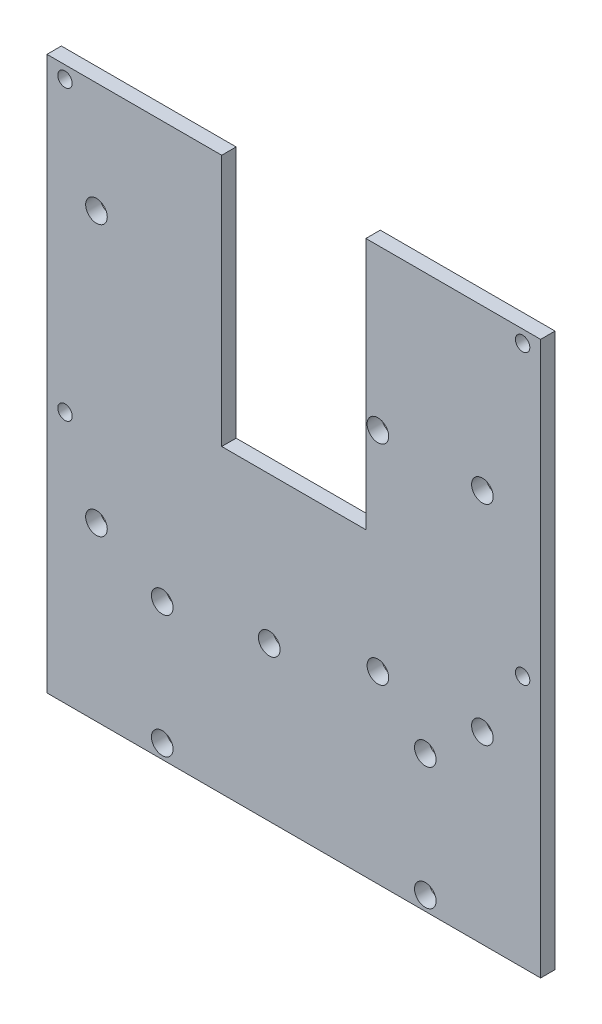
ISO-10303-21;
HEADER;
FILE_DESCRIPTION(('STEP AP214'),'2;1');
FILE_NAME('part.step','',(''),(''),'','','');
FILE_SCHEMA(('AUTOMOTIVE_DESIGN { 1 0 10303 214 1 1 1 1 }'));
ENDSEC;
DATA;
#1=APPLICATION_CONTEXT('core data for automotive mechanical design processes');
#2=APPLICATION_PROTOCOL_DEFINITION('international standard','automotive_design',2000,#1);
#3=PRODUCT_CONTEXT('',#1,'mechanical');
#4=PRODUCT('Part','Part','',(#3));
#5=PRODUCT_RELATED_PRODUCT_CATEGORY('part','',(#4));
#6=PRODUCT_DEFINITION_FORMATION('','',#4);
#7=PRODUCT_DEFINITION_CONTEXT('part definition',#1,'design');
#8=PRODUCT_DEFINITION('design','',#6,#7);
#9=PRODUCT_DEFINITION_SHAPE('','',#8);
#10=(LENGTH_UNIT() NAMED_UNIT(*) SI_UNIT(.MILLI.,.METRE.));
#11=(NAMED_UNIT(*) PLANE_ANGLE_UNIT() SI_UNIT($,.RADIAN.));
#12=(NAMED_UNIT(*) SI_UNIT($,.STERADIAN.) SOLID_ANGLE_UNIT());
#13=UNCERTAINTY_MEASURE_WITH_UNIT(LENGTH_MEASURE(1.E-05),#10,'distance_accuracy_value','');
#14=(GEOMETRIC_REPRESENTATION_CONTEXT(3) GLOBAL_UNCERTAINTY_ASSIGNED_CONTEXT((#13)) GLOBAL_UNIT_ASSIGNED_CONTEXT((#10,
#11,#12)) REPRESENTATION_CONTEXT('',''));
#15=CARTESIAN_POINT('',(0.,0.,0.));
#16=DIRECTION('',(0.,0.,1.));
#17=DIRECTION('',(1.,0.,0.));
#18=AXIS2_PLACEMENT_3D('',#15,#16,#17);
#19=CARTESIAN_POINT('',(153.,190.,4.));
#20=DIRECTION('',(0.,0.,1.));
#21=DIRECTION('',(1.,0.,0.));
#22=AXIS2_PLACEMENT_3D('',#19,#20,#21);
#23=PLANE('',#22);
#24=DIRECTION('',(0.,1.,0.));
#25=VECTOR('',#24,1.);
#26=CARTESIAN_POINT('',(4.,190.,4.));
#27=LINE('',#26,#25);
#28=CARTESIAN_POINT('',(3.99999999999998,-30.,4.));
#29=VERTEX_POINT('',#28);
#30=CARTESIAN_POINT('',(4.,123.48356312963,4.));
#31=VERTEX_POINT('',#30);
#32=EDGE_CURVE('E104',#29,#31,#27,.T.);
#33=ORIENTED_EDGE('',*,*,#32,.F.);
#34=DIRECTION('',(1.,0.,0.));
#35=VECTOR('',#34,1.);
#36=CARTESIAN_POINT('',(0.,-30.,4.));
#37=LINE('',#36,#35);
#38=CARTESIAN_POINT('',(141.001388932909,-29.9999999999999,4.));
#39=VERTEX_POINT('',#38);
#40=EDGE_CURVE('E60',#29,#39,#37,.T.);
#41=ORIENTED_EDGE('',*,*,#40,.T.);
#42=DIRECTION('',(0.,-1.,0.));
#43=VECTOR('',#42,1.);
#44=CARTESIAN_POINT('',(141.001388932909,190.,4.));
#45=LINE('',#44,#43);
#46=CARTESIAN_POINT('',(141.001388932909,123.48356312963,4.));
#47=VERTEX_POINT('',#46);
#48=EDGE_CURVE('E235',#47,#39,#45,.T.);
#49=ORIENTED_EDGE('',*,*,#48,.F.);
#50=DIRECTION('',(1.,0.,0.));
#51=VECTOR('',#50,1.);
#52=CARTESIAN_POINT('',(153.,123.48356312963,4.));
#53=LINE('',#52,#51);
#54=CARTESIAN_POINT('',(92.5,123.48356312963,4.));
#55=VERTEX_POINT('',#54);
#56=EDGE_CURVE('E126',#55,#47,#53,.T.);
#57=ORIENTED_EDGE('',*,*,#56,.F.);
#58=DIRECTION('',(0.,-1.,0.));
#59=VECTOR('',#58,1.);
#60=CARTESIAN_POINT('',(92.5,190.,4.));
#61=LINE('',#60,#59);
#62=CARTESIAN_POINT('',(92.5,53.4835631296301,4.));
#63=VERTEX_POINT('',#62);
#64=EDGE_CURVE('E128',#55,#63,#61,.T.);
#65=ORIENTED_EDGE('',*,*,#64,.T.);
#66=DIRECTION('',(-1.,0.,0.));
#67=VECTOR('',#66,1.);
#68=CARTESIAN_POINT('',(153.,53.4835631296301,4.));
#69=LINE('',#68,#67);
#70=CARTESIAN_POINT('',(52.5,53.4835631296302,4.));
#71=VERTEX_POINT('',#70);
#72=EDGE_CURVE('E124',#63,#71,#69,.T.);
#73=ORIENTED_EDGE('',*,*,#72,.T.);
#74=DIRECTION('',(0.,1.,0.));
#75=VECTOR('',#74,1.);
#76=CARTESIAN_POINT('',(52.5,190.,4.));
#77=LINE('',#76,#75);
#78=CARTESIAN_POINT('',(52.5,123.48356312963,4.));
#79=VERTEX_POINT('',#78);
#80=EDGE_CURVE('E254',#71,#79,#77,.T.);
#81=ORIENTED_EDGE('',*,*,#80,.T.);
#82=EDGE_CURVE('E132',#31,#79,#53,.T.);
#83=ORIENTED_EDGE('',*,*,#82,.F.);
#84=EDGE_LOOP('',(#33,#41,#49,#57,#65,#73,#81,#83));
#85=FACE_BOUND('',#84,.T.);
#86=CARTESIAN_POINT('',(136.,40.0000000000001,4.));
#87=DIRECTION('',(0.,0.,1.));
#88=DIRECTION('',(1.,0.,0.));
#89=AXIS2_PLACEMENT_3D('',#86,#87,#88);
#90=CIRCLE('',#89,2.);
#91=CARTESIAN_POINT('',(138.,40.0000000000001,4.));
#92=VERTEX_POINT('',#91);
#93=EDGE_CURVE('E207',#92,#92,#90,.T.);
#94=ORIENTED_EDGE('',*,*,#93,.F.);
#95=EDGE_LOOP('',(#94));
#96=FACE_BOUND('',#95,.T.);
#97=CARTESIAN_POINT('',(136.,120.,4.));
#98=DIRECTION('',(0.,0.,1.));
#99=DIRECTION('',(1.,0.,0.));
#100=AXIS2_PLACEMENT_3D('',#97,#98,#99);
#101=CIRCLE('',#100,2.);
#102=CARTESIAN_POINT('',(138.,120.,4.));
#103=VERTEX_POINT('',#102);
#104=EDGE_CURVE('E213',#103,#103,#101,.T.);
#105=ORIENTED_EDGE('',*,*,#104,.F.);
#106=EDGE_LOOP('',(#105));
#107=FACE_BOUND('',#106,.T.);
#108=CARTESIAN_POINT('',(9.00000000000001,40.0000000000002,4.));
#109=DIRECTION('',(0.,0.,1.));
#110=DIRECTION('',(-1.,0.,0.));
#111=AXIS2_PLACEMENT_3D('',#108,#109,#110);
#112=CIRCLE('',#111,2.);
#113=CARTESIAN_POINT('',(7.00000000000001,40.0000000000002,4.));
#114=VERTEX_POINT('',#113);
#115=EDGE_CURVE('E219',#114,#114,#112,.T.);
#116=ORIENTED_EDGE('',*,*,#115,.F.);
#117=EDGE_LOOP('',(#116));
#118=FACE_BOUND('',#117,.T.);
#119=CARTESIAN_POINT('',(9.00000000000001,120.,4.));
#120=DIRECTION('',(0.,0.,1.));
#121=DIRECTION('',(-1.,0.,0.));
#122=AXIS2_PLACEMENT_3D('',#119,#120,#121);
#123=CIRCLE('',#122,2.);
#124=CARTESIAN_POINT('',(7.00000000000001,120.,4.));
#125=VERTEX_POINT('',#124);
#126=EDGE_CURVE('E201',#125,#125,#123,.T.);
#127=ORIENTED_EDGE('',*,*,#126,.F.);
#128=EDGE_LOOP('',(#127));
#129=FACE_BOUND('',#128,.T.);
#130=CARTESIAN_POINT('',(109.,7.96058954776427,4.));
#131=DIRECTION('',(0.,0.,1.));
#132=DIRECTION('',(1.,0.,0.));
#133=AXIS2_PLACEMENT_3D('',#130,#131,#132);
#134=CIRCLE('',#133,3.00000000000001);
#135=CARTESIAN_POINT('',(112.,7.96058954776427,4.));
#136=VERTEX_POINT('',#135);
#137=EDGE_CURVE('E197',#136,#136,#134,.T.);
#138=ORIENTED_EDGE('',*,*,#137,.F.);
#139=EDGE_LOOP('',(#138));
#140=FACE_BOUND('',#139,.T.);
#141=CARTESIAN_POINT('',(36.,7.96058954776427,4.));
#142=DIRECTION('',(0.,0.,1.));
#143=DIRECTION('',(1.,0.,0.));
#144=AXIS2_PLACEMENT_3D('',#141,#142,#143);
#145=CIRCLE('',#144,3.);
#146=CARTESIAN_POINT('',(39.,7.96058954776427,4.));
#147=VERTEX_POINT('',#146);
#148=EDGE_CURVE('E191',#147,#147,#145,.T.);
#149=ORIENTED_EDGE('',*,*,#148,.F.);
#150=EDGE_LOOP('',(#149));
#151=FACE_BOUND('',#150,.T.);
#152=CARTESIAN_POINT('',(109.,-26.0394104522357,4.));
#153=DIRECTION('',(0.,0.,1.));
#154=DIRECTION('',(1.,0.,0.));
#155=AXIS2_PLACEMENT_3D('',#152,#153,#154);
#156=CIRCLE('',#155,3.00000000000001);
#157=CARTESIAN_POINT('',(112.,-26.0394104522357,4.));
#158=VERTEX_POINT('',#157);
#159=EDGE_CURVE('E185',#158,#158,#156,.T.);
#160=ORIENTED_EDGE('',*,*,#159,.F.);
#161=EDGE_LOOP('',(#160));
#162=FACE_BOUND('',#161,.T.);
#163=CARTESIAN_POINT('',(36.,-26.0394104522357,4.));
#164=DIRECTION('',(0.,0.,1.));
#165=DIRECTION('',(1.,0.,0.));
#166=AXIS2_PLACEMENT_3D('',#163,#164,#165);
#167=CIRCLE('',#166,3.);
#168=CARTESIAN_POINT('',(39.,-26.0394104522357,4.));
#169=VERTEX_POINT('',#168);
#170=EDGE_CURVE('E179',#169,#169,#167,.T.);
#171=ORIENTED_EDGE('',*,*,#170,.F.);
#172=EDGE_LOOP('',(#171));
#173=FACE_BOUND('',#172,.T.);
#174=CARTESIAN_POINT('',(124.840103492378,79.0732809509047,4.));
#175=DIRECTION('',(0.,0.,1.));
#176=DIRECTION('',(1.,0.,0.));
#177=AXIS2_PLACEMENT_3D('',#174,#175,#176);
#178=CIRCLE('',#177,2.99999999999999);
#179=CARTESIAN_POINT('',(127.840103492378,79.0732809509047,4.));
#180=VERTEX_POINT('',#179);
#181=EDGE_CURVE('E173',#180,#180,#178,.T.);
#182=ORIENTED_EDGE('',*,*,#181,.F.);
#183=EDGE_LOOP('',(#182));
#184=FACE_BOUND('',#183,.T.);
#185=CARTESIAN_POINT('',(124.840103492378,21.0732809509047,4.));
#186=DIRECTION('',(0.,0.,1.));
#187=DIRECTION('',(1.,0.,0.));
#188=AXIS2_PLACEMENT_3D('',#185,#186,#187);
#189=CIRCLE('',#188,2.99999999999999);
#190=CARTESIAN_POINT('',(127.840103492378,21.0732809509047,4.));
#191=VERTEX_POINT('',#190);
#192=EDGE_CURVE('E167',#191,#191,#189,.T.);
#193=ORIENTED_EDGE('',*,*,#192,.F.);
#194=EDGE_LOOP('',(#193));
#195=FACE_BOUND('',#194,.T.);
#196=CARTESIAN_POINT('',(95.8401034923781,21.0732809509047,4.));
#197=DIRECTION('',(0.,0.,1.));
#198=DIRECTION('',(1.,0.,0.));
#199=AXIS2_PLACEMENT_3D('',#196,#197,#198);
#200=CIRCLE('',#199,3.00000000000001);
#201=CARTESIAN_POINT('',(98.8401034923781,21.0732809509047,4.));
#202=VERTEX_POINT('',#201);
#203=EDGE_CURVE('E161',#202,#202,#200,.T.);
#204=ORIENTED_EDGE('',*,*,#203,.F.);
#205=EDGE_LOOP('',(#204));
#206=FACE_BOUND('',#205,.T.);
#207=CARTESIAN_POINT('',(95.8401034923781,79.0732809509047,4.));
#208=DIRECTION('',(0.,0.,1.));
#209=DIRECTION('',(1.,0.,0.));
#210=AXIS2_PLACEMENT_3D('',#207,#208,#209);
#211=CIRCLE('',#210,3.00000000000001);
#212=CARTESIAN_POINT('',(98.8401034923781,79.0732809509047,4.));
#213=VERTEX_POINT('',#212);
#214=EDGE_CURVE('E155',#213,#213,#211,.T.);
#215=ORIENTED_EDGE('',*,*,#214,.F.);
#216=EDGE_LOOP('',(#215));
#217=FACE_BOUND('',#216,.T.);
#218=CARTESIAN_POINT('',(65.6827343698865,12.7433023432609,4.));
#219=DIRECTION('',(0.,0.,1.));
#220=DIRECTION('',(1.,0.,0.));
#221=AXIS2_PLACEMENT_3D('',#218,#219,#220);
#222=CIRCLE('',#221,3.00000000000001);
#223=CARTESIAN_POINT('',(68.6827343698865,12.7433023432609,4.));
#224=VERTEX_POINT('',#223);
#225=EDGE_CURVE('E149',#224,#224,#222,.T.);
#226=ORIENTED_EDGE('',*,*,#225,.F.);
#227=EDGE_LOOP('',(#226));
#228=FACE_BOUND('',#227,.T.);
#229=CARTESIAN_POINT('',(17.7424005446624,17.7397403470867,4.));
#230=DIRECTION('',(0.,0.,1.));
#231=DIRECTION('',(1.,0.,0.));
#232=AXIS2_PLACEMENT_3D('',#229,#230,#231);
#233=CIRCLE('',#232,3.);
#234=CARTESIAN_POINT('',(20.7424005446624,17.7397403470867,4.));
#235=VERTEX_POINT('',#234);
#236=EDGE_CURVE('E143',#235,#235,#233,.T.);
#237=ORIENTED_EDGE('',*,*,#236,.F.);
#238=EDGE_LOOP('',(#237));
#239=FACE_BOUND('',#238,.T.);
#240=CARTESIAN_POINT('',(17.7424005446624,92.7397403470867,4.));
#241=DIRECTION('',(0.,0.,1.));
#242=DIRECTION('',(1.,0.,0.));
#243=AXIS2_PLACEMENT_3D('',#240,#241,#242);
#244=CIRCLE('',#243,3.);
#245=CARTESIAN_POINT('',(20.7424005446624,92.7397403470867,4.));
#246=VERTEX_POINT('',#245);
#247=EDGE_CURVE('E137',#246,#246,#244,.T.);
#248=ORIENTED_EDGE('',*,*,#247,.F.);
#249=EDGE_LOOP('',(#248));
#250=FACE_BOUND('',#249,.T.);
#251=ADVANCED_FACE('F38',(#85,#96,#107,#118,#129,#140,#151,#162,#173,#184,#195,#206,#217,#228,
#239,#250),#23,.T.);
#252=CARTESIAN_POINT('',(153.,190.,0.));
#253=DIRECTION('',(0.,0.,1.));
#254=DIRECTION('',(1.,0.,0.));
#255=AXIS2_PLACEMENT_3D('',#252,#253,#254);
#256=PLANE('',#255);
#257=CARTESIAN_POINT('',(9.00000000000001,120.,0.));
#258=DIRECTION('',(0.,0.,1.));
#259=DIRECTION('',(-1.,0.,0.));
#260=AXIS2_PLACEMENT_3D('',#257,#258,#259);
#261=CIRCLE('',#260,2.);
#262=CARTESIAN_POINT('',(7.00000000000001,120.,0.));
#263=VERTEX_POINT('',#262);
#264=EDGE_CURVE('E200',#263,#263,#261,.T.);
#265=ORIENTED_EDGE('',*,*,#264,.T.);
#266=EDGE_LOOP('',(#265));
#267=FACE_BOUND('',#266,.T.);
#268=CARTESIAN_POINT('',(136.,40.0000000000001,0.));
#269=DIRECTION('',(0.,0.,1.));
#270=DIRECTION('',(1.,0.,0.));
#271=AXIS2_PLACEMENT_3D('',#268,#269,#270);
#272=CIRCLE('',#271,2.);
#273=CARTESIAN_POINT('',(138.,40.0000000000001,0.));
#274=VERTEX_POINT('',#273);
#275=EDGE_CURVE('E204',#274,#274,#272,.T.);
#276=ORIENTED_EDGE('',*,*,#275,.T.);
#277=EDGE_LOOP('',(#276));
#278=FACE_BOUND('',#277,.T.);
#279=CARTESIAN_POINT('',(136.,120.,0.));
#280=DIRECTION('',(0.,0.,1.));
#281=DIRECTION('',(1.,0.,0.));
#282=AXIS2_PLACEMENT_3D('',#279,#280,#281);
#283=CIRCLE('',#282,2.);
#284=CARTESIAN_POINT('',(138.,120.,0.));
#285=VERTEX_POINT('',#284);
#286=EDGE_CURVE('E210',#285,#285,#283,.T.);
#287=ORIENTED_EDGE('',*,*,#286,.T.);
#288=EDGE_LOOP('',(#287));
#289=FACE_BOUND('',#288,.T.);
#290=CARTESIAN_POINT('',(9.00000000000001,40.0000000000002,0.));
#291=DIRECTION('',(0.,0.,1.));
#292=DIRECTION('',(-1.,0.,0.));
#293=AXIS2_PLACEMENT_3D('',#290,#291,#292);
#294=CIRCLE('',#293,2.);
#295=CARTESIAN_POINT('',(7.00000000000001,40.0000000000002,0.));
#296=VERTEX_POINT('',#295);
#297=EDGE_CURVE('E216',#296,#296,#294,.T.);
#298=ORIENTED_EDGE('',*,*,#297,.T.);
#299=EDGE_LOOP('',(#298));
#300=FACE_BOUND('',#299,.T.);
#301=CARTESIAN_POINT('',(109.,7.96058954776427,0.));
#302=DIRECTION('',(0.,0.,-1.));
#303=DIRECTION('',(-1.,0.,0.));
#304=AXIS2_PLACEMENT_3D('',#301,#302,#303);
#305=CIRCLE('',#304,3.00000000000001);
#306=CARTESIAN_POINT('',(106.,7.96058954776427,0.));
#307=VERTEX_POINT('',#306);
#308=EDGE_CURVE('E194',#307,#307,#305,.T.);
#309=ORIENTED_EDGE('',*,*,#308,.F.);
#310=EDGE_LOOP('',(#309));
#311=FACE_BOUND('',#310,.T.);
#312=CARTESIAN_POINT('',(36.,7.96058954776427,0.));
#313=DIRECTION('',(0.,0.,-1.));
#314=DIRECTION('',(-1.,0.,0.));
#315=AXIS2_PLACEMENT_3D('',#312,#313,#314);
#316=CIRCLE('',#315,3.);
#317=CARTESIAN_POINT('',(33.,7.96058954776427,0.));
#318=VERTEX_POINT('',#317);
#319=EDGE_CURVE('E188',#318,#318,#316,.T.);
#320=ORIENTED_EDGE('',*,*,#319,.F.);
#321=EDGE_LOOP('',(#320));
#322=FACE_BOUND('',#321,.T.);
#323=CARTESIAN_POINT('',(109.,-26.0394104522357,0.));
#324=DIRECTION('',(0.,0.,-1.));
#325=DIRECTION('',(-1.,0.,0.));
#326=AXIS2_PLACEMENT_3D('',#323,#324,#325);
#327=CIRCLE('',#326,3.00000000000001);
#328=CARTESIAN_POINT('',(106.,-26.0394104522357,0.));
#329=VERTEX_POINT('',#328);
#330=EDGE_CURVE('E182',#329,#329,#327,.T.);
#331=ORIENTED_EDGE('',*,*,#330,.F.);
#332=EDGE_LOOP('',(#331));
#333=FACE_BOUND('',#332,.T.);
#334=CARTESIAN_POINT('',(36.,-26.0394104522357,0.));
#335=DIRECTION('',(0.,0.,-1.));
#336=DIRECTION('',(-1.,0.,0.));
#337=AXIS2_PLACEMENT_3D('',#334,#335,#336);
#338=CIRCLE('',#337,3.);
#339=CARTESIAN_POINT('',(33.,-26.0394104522357,0.));
#340=VERTEX_POINT('',#339);
#341=EDGE_CURVE('E176',#340,#340,#338,.T.);
#342=ORIENTED_EDGE('',*,*,#341,.F.);
#343=EDGE_LOOP('',(#342));
#344=FACE_BOUND('',#343,.T.);
#345=CARTESIAN_POINT('',(124.840103492378,79.0732809509047,0.));
#346=DIRECTION('',(0.,0.,-1.));
#347=DIRECTION('',(-1.,0.,0.));
#348=AXIS2_PLACEMENT_3D('',#345,#346,#347);
#349=CIRCLE('',#348,2.99999999999999);
#350=CARTESIAN_POINT('',(121.840103492378,79.0732809509047,0.));
#351=VERTEX_POINT('',#350);
#352=EDGE_CURVE('E170',#351,#351,#349,.T.);
#353=ORIENTED_EDGE('',*,*,#352,.F.);
#354=EDGE_LOOP('',(#353));
#355=FACE_BOUND('',#354,.T.);
#356=CARTESIAN_POINT('',(124.840103492378,21.0732809509047,0.));
#357=DIRECTION('',(0.,0.,-1.));
#358=DIRECTION('',(-1.,0.,0.));
#359=AXIS2_PLACEMENT_3D('',#356,#357,#358);
#360=CIRCLE('',#359,2.99999999999999);
#361=CARTESIAN_POINT('',(121.840103492378,21.0732809509047,0.));
#362=VERTEX_POINT('',#361);
#363=EDGE_CURVE('E164',#362,#362,#360,.T.);
#364=ORIENTED_EDGE('',*,*,#363,.F.);
#365=EDGE_LOOP('',(#364));
#366=FACE_BOUND('',#365,.T.);
#367=CARTESIAN_POINT('',(95.8401034923781,21.0732809509047,0.));
#368=DIRECTION('',(0.,0.,-1.));
#369=DIRECTION('',(-1.,0.,0.));
#370=AXIS2_PLACEMENT_3D('',#367,#368,#369);
#371=CIRCLE('',#370,3.00000000000001);
#372=CARTESIAN_POINT('',(92.8401034923781,21.0732809509047,0.));
#373=VERTEX_POINT('',#372);
#374=EDGE_CURVE('E158',#373,#373,#371,.T.);
#375=ORIENTED_EDGE('',*,*,#374,.F.);
#376=EDGE_LOOP('',(#375));
#377=FACE_BOUND('',#376,.T.);
#378=CARTESIAN_POINT('',(95.8401034923781,79.0732809509047,0.));
#379=DIRECTION('',(0.,0.,-1.));
#380=DIRECTION('',(-1.,0.,0.));
#381=AXIS2_PLACEMENT_3D('',#378,#379,#380);
#382=CIRCLE('',#381,3.00000000000001);
#383=CARTESIAN_POINT('',(92.8401034923781,79.0732809509047,0.));
#384=VERTEX_POINT('',#383);
#385=EDGE_CURVE('E152',#384,#384,#382,.T.);
#386=ORIENTED_EDGE('',*,*,#385,.F.);
#387=EDGE_LOOP('',(#386));
#388=FACE_BOUND('',#387,.T.);
#389=CARTESIAN_POINT('',(65.6827343698865,12.7433023432609,0.));
#390=DIRECTION('',(0.,0.,-1.));
#391=DIRECTION('',(-1.,0.,0.));
#392=AXIS2_PLACEMENT_3D('',#389,#390,#391);
#393=CIRCLE('',#392,3.00000000000001);
#394=CARTESIAN_POINT('',(62.6827343698865,12.7433023432609,0.));
#395=VERTEX_POINT('',#394);
#396=EDGE_CURVE('E146',#395,#395,#393,.T.);
#397=ORIENTED_EDGE('',*,*,#396,.F.);
#398=EDGE_LOOP('',(#397));
#399=FACE_BOUND('',#398,.T.);
#400=CARTESIAN_POINT('',(17.7424005446624,17.7397403470867,0.));
#401=DIRECTION('',(0.,0.,-1.));
#402=DIRECTION('',(-1.,0.,0.));
#403=AXIS2_PLACEMENT_3D('',#400,#401,#402);
#404=CIRCLE('',#403,3.);
#405=CARTESIAN_POINT('',(14.7424005446624,17.7397403470867,0.));
#406=VERTEX_POINT('',#405);
#407=EDGE_CURVE('E140',#406,#406,#404,.T.);
#408=ORIENTED_EDGE('',*,*,#407,.F.);
#409=EDGE_LOOP('',(#408));
#410=FACE_BOUND('',#409,.T.);
#411=CARTESIAN_POINT('',(17.7424005446624,92.7397403470867,0.));
#412=DIRECTION('',(0.,0.,-1.));
#413=DIRECTION('',(-1.,0.,0.));
#414=AXIS2_PLACEMENT_3D('',#411,#412,#413);
#415=CIRCLE('',#414,3.);
#416=CARTESIAN_POINT('',(14.7424005446624,92.7397403470867,0.));
#417=VERTEX_POINT('',#416);
#418=EDGE_CURVE('E134',#417,#417,#415,.T.);
#419=ORIENTED_EDGE('',*,*,#418,.F.);
#420=EDGE_LOOP('',(#419));
#421=FACE_BOUND('',#420,.T.);
#422=DIRECTION('',(1.,0.,0.));
#423=VECTOR('',#422,1.);
#424=CARTESIAN_POINT('',(0.,-30.,0.));
#425=LINE('',#424,#423);
#426=CARTESIAN_POINT('',(4.,-30.,0.));
#427=VERTEX_POINT('',#426);
#428=CARTESIAN_POINT('',(141.001388932909,-29.9999999999999,0.));
#429=VERTEX_POINT('',#428);
#430=EDGE_CURVE('E117',#427,#429,#425,.T.);
#431=ORIENTED_EDGE('',*,*,#430,.F.);
#432=DIRECTION('',(0.,-1.,0.));
#433=VECTOR('',#432,1.);
#434=CARTESIAN_POINT('',(4.,153.448037880647,0.));
#435=LINE('',#434,#433);
#436=CARTESIAN_POINT('',(4.,123.48356312963,0.));
#437=VERTEX_POINT('',#436);
#438=EDGE_CURVE('E53',#437,#427,#435,.T.);
#439=ORIENTED_EDGE('',*,*,#438,.F.);
#440=DIRECTION('',(-1.,0.,0.));
#441=VECTOR('',#440,1.);
#442=CARTESIAN_POINT('',(154.568758673654,123.48356312963,0.));
#443=LINE('',#442,#441);
#444=CARTESIAN_POINT('',(52.5,123.48356312963,0.));
#445=VERTEX_POINT('',#444);
#446=EDGE_CURVE('E115',#445,#437,#443,.T.);
#447=ORIENTED_EDGE('',*,*,#446,.F.);
#448=DIRECTION('',(0.,-1.,0.));
#449=VECTOR('',#448,1.);
#450=CARTESIAN_POINT('',(52.5,0.,0.));
#451=LINE('',#450,#449);
#452=CARTESIAN_POINT('',(52.5,53.4835631296302,0.));
#453=VERTEX_POINT('',#452);
#454=EDGE_CURVE('E247',#445,#453,#451,.T.);
#455=ORIENTED_EDGE('',*,*,#454,.T.);
#456=DIRECTION('',(1.,0.,0.));
#457=VECTOR('',#456,1.);
#458=CARTESIAN_POINT('',(0.,53.4835631296302,0.));
#459=LINE('',#458,#457);
#460=CARTESIAN_POINT('',(92.5,53.4835631296301,0.));
#461=VERTEX_POINT('',#460);
#462=EDGE_CURVE('E244',#453,#461,#459,.T.);
#463=ORIENTED_EDGE('',*,*,#462,.T.);
#464=DIRECTION('',(0.,1.,0.));
#465=VECTOR('',#464,1.);
#466=CARTESIAN_POINT('',(92.5,0.,0.));
#467=LINE('',#466,#465);
#468=CARTESIAN_POINT('',(92.5,123.48356312963,0.));
#469=VERTEX_POINT('',#468);
#470=EDGE_CURVE('E249',#461,#469,#467,.T.);
#471=ORIENTED_EDGE('',*,*,#470,.T.);
#472=CARTESIAN_POINT('',(141.001388932909,123.48356312963,0.));
#473=VERTEX_POINT('',#472);
#474=EDGE_CURVE('E123',#473,#469,#443,.T.);
#475=ORIENTED_EDGE('',*,*,#474,.F.);
#476=DIRECTION('',(0.,1.,0.));
#477=VECTOR('',#476,1.);
#478=CARTESIAN_POINT('',(141.001388932909,153.448037880647,0.));
#479=LINE('',#478,#477);
#480=EDGE_CURVE('E108',#429,#473,#479,.T.);
#481=ORIENTED_EDGE('',*,*,#480,.F.);
#482=EDGE_LOOP('',(#431,#439,#447,#455,#463,#471,#475,#481));
#483=FACE_BOUND('',#482,.T.);
#484=ADVANCED_FACE('F113',(#267,#278,#289,#300,#311,#322,#333,#344,#355,#366,#377,#388,#399,
#410,#421,#483),#256,.F.);
#485=CARTESIAN_POINT('',(154.568758673654,123.48356312963,10.));
#486=DIRECTION('',(0.,-1.,0.));
#487=DIRECTION('',(0.,0.,-1.));
#488=AXIS2_PLACEMENT_3D('',#485,#486,#487);
#489=PLANE('',#488);
#490=ORIENTED_EDGE('',*,*,#56,.T.);
#491=DIRECTION('',(0.,0.,-1.));
#492=VECTOR('',#491,1.);
#493=CARTESIAN_POINT('',(141.001388932909,123.48356312963,10.));
#494=LINE('',#493,#492);
#495=EDGE_CURVE('E239',#47,#473,#494,.T.);
#496=ORIENTED_EDGE('',*,*,#495,.T.);
#497=ORIENTED_EDGE('',*,*,#474,.T.);
#498=DIRECTION('',(0.,0.,-1.));
#499=VECTOR('',#498,1.);
#500=CARTESIAN_POINT('',(92.5,123.48356312963,10.));
#501=LINE('',#500,#499);
#502=EDGE_CURVE('E227',#55,#469,#501,.T.);
#503=ORIENTED_EDGE('',*,*,#502,.F.);
#504=EDGE_LOOP('',(#490,#496,#497,#503));
#505=FACE_BOUND('',#504,.T.);
#506=ADVANCED_FACE('F267',(#505),#489,.F.);
#507=ORIENTED_EDGE('',*,*,#446,.T.);
#508=DIRECTION('',(0.,0.,1.));
#509=VECTOR('',#508,1.);
#510=CARTESIAN_POINT('',(4.,123.48356312963,10.));
#511=LINE('',#510,#509);
#512=EDGE_CURVE('E102',#437,#31,#511,.T.);
#513=ORIENTED_EDGE('',*,*,#512,.T.);
#514=ORIENTED_EDGE('',*,*,#82,.T.);
#515=DIRECTION('',(0.,0.,1.));
#516=VECTOR('',#515,1.);
#517=CARTESIAN_POINT('',(52.5,123.48356312963,10.));
#518=LINE('',#517,#516);
#519=EDGE_CURVE('E122',#445,#79,#518,.T.);
#520=ORIENTED_EDGE('',*,*,#519,.F.);
#521=EDGE_LOOP('',(#507,#513,#514,#520));
#522=FACE_BOUND('',#521,.T.);
#523=ADVANCED_FACE('F120',(#522),#489,.F.);
#524=CARTESIAN_POINT('',(0.,-30.,4.));
#525=DIRECTION('',(0.,1.,0.));
#526=DIRECTION('',(-1.,0.,0.));
#527=AXIS2_PLACEMENT_3D('',#524,#525,#526);
#528=PLANE('',#527);
#529=ORIENTED_EDGE('',*,*,#40,.F.);
#530=DIRECTION('',(0.,0.,-1.));
#531=VECTOR('',#530,1.);
#532=CARTESIAN_POINT('',(3.99999999999998,-30.,4.));
#533=LINE('',#532,#531);
#534=EDGE_CURVE('E11',#29,#427,#533,.T.);
#535=ORIENTED_EDGE('',*,*,#534,.T.);
#536=ORIENTED_EDGE('',*,*,#430,.T.);
#537=DIRECTION('',(0.,0.,1.));
#538=VECTOR('',#537,1.);
#539=CARTESIAN_POINT('',(141.001388932909,-29.9999999999999,4.));
#540=LINE('',#539,#538);
#541=EDGE_CURVE('E46',#429,#39,#540,.T.);
#542=ORIENTED_EDGE('',*,*,#541,.T.);
#543=EDGE_LOOP('',(#529,#535,#536,#542));
#544=FACE_BOUND('',#543,.T.);
#545=ADVANCED_FACE('F40',(#544),#528,.F.);
#546=CARTESIAN_POINT('',(9.00000000000001,40.0000000000002,4.));
#547=DIRECTION('',(0.,0.,-1.));
#548=DIRECTION('',(-1.,0.,0.));
#549=AXIS2_PLACEMENT_3D('',#546,#547,#548);
#550=CYLINDRICAL_SURFACE('',#549,2.);
#551=ORIENTED_EDGE('',*,*,#115,.T.);
#552=EDGE_LOOP('',(#551));
#553=FACE_BOUND('',#552,.T.);
#554=ORIENTED_EDGE('',*,*,#297,.F.);
#555=EDGE_LOOP('',(#554));
#556=FACE_BOUND('',#555,.T.);
#557=ADVANCED_FACE('F282',(#553,#556),#550,.F.);
#558=CARTESIAN_POINT('',(136.,120.,4.));
#559=DIRECTION('',(0.,0.,-1.));
#560=DIRECTION('',(-1.,0.,0.));
#561=AXIS2_PLACEMENT_3D('',#558,#559,#560);
#562=CYLINDRICAL_SURFACE('',#561,2.);
#563=ORIENTED_EDGE('',*,*,#104,.T.);
#564=EDGE_LOOP('',(#563));
#565=FACE_BOUND('',#564,.T.);
#566=ORIENTED_EDGE('',*,*,#286,.F.);
#567=EDGE_LOOP('',(#566));
#568=FACE_BOUND('',#567,.T.);
#569=ADVANCED_FACE('F285',(#565,#568),#562,.F.);
#570=CARTESIAN_POINT('',(136.,40.0000000000001,4.));
#571=DIRECTION('',(0.,0.,-1.));
#572=DIRECTION('',(-1.,0.,0.));
#573=AXIS2_PLACEMENT_3D('',#570,#571,#572);
#574=CYLINDRICAL_SURFACE('',#573,2.);
#575=ORIENTED_EDGE('',*,*,#93,.T.);
#576=EDGE_LOOP('',(#575));
#577=FACE_BOUND('',#576,.T.);
#578=ORIENTED_EDGE('',*,*,#275,.F.);
#579=EDGE_LOOP('',(#578));
#580=FACE_BOUND('',#579,.T.);
#581=ADVANCED_FACE('F289',(#577,#580),#574,.F.);
#582=CARTESIAN_POINT('',(9.00000000000001,120.,4.));
#583=DIRECTION('',(0.,0.,-1.));
#584=DIRECTION('',(-1.,0.,0.));
#585=AXIS2_PLACEMENT_3D('',#582,#583,#584);
#586=CYLINDRICAL_SURFACE('',#585,2.);
#587=ORIENTED_EDGE('',*,*,#126,.T.);
#588=EDGE_LOOP('',(#587));
#589=FACE_BOUND('',#588,.T.);
#590=ORIENTED_EDGE('',*,*,#264,.F.);
#591=EDGE_LOOP('',(#590));
#592=FACE_BOUND('',#591,.T.);
#593=ADVANCED_FACE('F293',(#589,#592),#586,.F.);
#594=CARTESIAN_POINT('',(109.,7.96058954776427,10.));
#595=DIRECTION('',(0.,0.,-1.));
#596=DIRECTION('',(-1.,0.,0.));
#597=AXIS2_PLACEMENT_3D('',#594,#595,#596);
#598=CYLINDRICAL_SURFACE('',#597,3.00000000000001);
#599=ORIENTED_EDGE('',*,*,#137,.T.);
#600=EDGE_LOOP('',(#599));
#601=FACE_BOUND('',#600,.T.);
#602=ORIENTED_EDGE('',*,*,#308,.T.);
#603=EDGE_LOOP('',(#602));
#604=FACE_BOUND('',#603,.T.);
#605=ADVANCED_FACE('F297',(#601,#604),#598,.F.);
#606=CARTESIAN_POINT('',(36.,7.96058954776427,10.));
#607=DIRECTION('',(0.,0.,-1.));
#608=DIRECTION('',(-1.,0.,0.));
#609=AXIS2_PLACEMENT_3D('',#606,#607,#608);
#610=CYLINDRICAL_SURFACE('',#609,3.);
#611=ORIENTED_EDGE('',*,*,#148,.T.);
#612=EDGE_LOOP('',(#611));
#613=FACE_BOUND('',#612,.T.);
#614=ORIENTED_EDGE('',*,*,#319,.T.);
#615=EDGE_LOOP('',(#614));
#616=FACE_BOUND('',#615,.T.);
#617=ADVANCED_FACE('F301',(#613,#616),#610,.F.);
#618=CARTESIAN_POINT('',(109.,-26.0394104522357,10.));
#619=DIRECTION('',(0.,0.,-1.));
#620=DIRECTION('',(-1.,0.,0.));
#621=AXIS2_PLACEMENT_3D('',#618,#619,#620);
#622=CYLINDRICAL_SURFACE('',#621,3.00000000000001);
#623=ORIENTED_EDGE('',*,*,#159,.T.);
#624=EDGE_LOOP('',(#623));
#625=FACE_BOUND('',#624,.T.);
#626=ORIENTED_EDGE('',*,*,#330,.T.);
#627=EDGE_LOOP('',(#626));
#628=FACE_BOUND('',#627,.T.);
#629=ADVANCED_FACE('F305',(#625,#628),#622,.F.);
#630=CARTESIAN_POINT('',(36.,-26.0394104522357,10.));
#631=DIRECTION('',(0.,0.,-1.));
#632=DIRECTION('',(-1.,0.,0.));
#633=AXIS2_PLACEMENT_3D('',#630,#631,#632);
#634=CYLINDRICAL_SURFACE('',#633,3.);
#635=ORIENTED_EDGE('',*,*,#170,.T.);
#636=EDGE_LOOP('',(#635));
#637=FACE_BOUND('',#636,.T.);
#638=ORIENTED_EDGE('',*,*,#341,.T.);
#639=EDGE_LOOP('',(#638));
#640=FACE_BOUND('',#639,.T.);
#641=ADVANCED_FACE('F309',(#637,#640),#634,.F.);
#642=CARTESIAN_POINT('',(124.840103492378,79.0732809509047,10.));
#643=DIRECTION('',(0.,0.,-1.));
#644=DIRECTION('',(-1.,0.,0.));
#645=AXIS2_PLACEMENT_3D('',#642,#643,#644);
#646=CYLINDRICAL_SURFACE('',#645,2.99999999999999);
#647=ORIENTED_EDGE('',*,*,#181,.T.);
#648=EDGE_LOOP('',(#647));
#649=FACE_BOUND('',#648,.T.);
#650=ORIENTED_EDGE('',*,*,#352,.T.);
#651=EDGE_LOOP('',(#650));
#652=FACE_BOUND('',#651,.T.);
#653=ADVANCED_FACE('F313',(#649,#652),#646,.F.);
#654=CARTESIAN_POINT('',(124.840103492378,21.0732809509047,10.));
#655=DIRECTION('',(0.,0.,-1.));
#656=DIRECTION('',(-1.,0.,0.));
#657=AXIS2_PLACEMENT_3D('',#654,#655,#656);
#658=CYLINDRICAL_SURFACE('',#657,2.99999999999999);
#659=ORIENTED_EDGE('',*,*,#192,.T.);
#660=EDGE_LOOP('',(#659));
#661=FACE_BOUND('',#660,.T.);
#662=ORIENTED_EDGE('',*,*,#363,.T.);
#663=EDGE_LOOP('',(#662));
#664=FACE_BOUND('',#663,.T.);
#665=ADVANCED_FACE('F317',(#661,#664),#658,.F.);
#666=CARTESIAN_POINT('',(95.8401034923781,21.0732809509047,10.));
#667=DIRECTION('',(0.,0.,-1.));
#668=DIRECTION('',(-1.,0.,0.));
#669=AXIS2_PLACEMENT_3D('',#666,#667,#668);
#670=CYLINDRICAL_SURFACE('',#669,3.00000000000001);
#671=ORIENTED_EDGE('',*,*,#203,.T.);
#672=EDGE_LOOP('',(#671));
#673=FACE_BOUND('',#672,.T.);
#674=ORIENTED_EDGE('',*,*,#374,.T.);
#675=EDGE_LOOP('',(#674));
#676=FACE_BOUND('',#675,.T.);
#677=ADVANCED_FACE('F321',(#673,#676),#670,.F.);
#678=CARTESIAN_POINT('',(95.8401034923781,79.0732809509047,10.));
#679=DIRECTION('',(0.,0.,-1.));
#680=DIRECTION('',(-1.,0.,0.));
#681=AXIS2_PLACEMENT_3D('',#678,#679,#680);
#682=CYLINDRICAL_SURFACE('',#681,3.00000000000001);
#683=ORIENTED_EDGE('',*,*,#214,.T.);
#684=EDGE_LOOP('',(#683));
#685=FACE_BOUND('',#684,.T.);
#686=ORIENTED_EDGE('',*,*,#385,.T.);
#687=EDGE_LOOP('',(#686));
#688=FACE_BOUND('',#687,.T.);
#689=ADVANCED_FACE('F325',(#685,#688),#682,.F.);
#690=CARTESIAN_POINT('',(65.6827343698865,12.7433023432609,10.));
#691=DIRECTION('',(0.,0.,-1.));
#692=DIRECTION('',(-1.,0.,0.));
#693=AXIS2_PLACEMENT_3D('',#690,#691,#692);
#694=CYLINDRICAL_SURFACE('',#693,3.00000000000001);
#695=ORIENTED_EDGE('',*,*,#225,.T.);
#696=EDGE_LOOP('',(#695));
#697=FACE_BOUND('',#696,.T.);
#698=ORIENTED_EDGE('',*,*,#396,.T.);
#699=EDGE_LOOP('',(#698));
#700=FACE_BOUND('',#699,.T.);
#701=ADVANCED_FACE('F329',(#697,#700),#694,.F.);
#702=CARTESIAN_POINT('',(17.7424005446624,17.7397403470867,10.));
#703=DIRECTION('',(0.,0.,-1.));
#704=DIRECTION('',(-1.,0.,0.));
#705=AXIS2_PLACEMENT_3D('',#702,#703,#704);
#706=CYLINDRICAL_SURFACE('',#705,3.);
#707=ORIENTED_EDGE('',*,*,#236,.T.);
#708=EDGE_LOOP('',(#707));
#709=FACE_BOUND('',#708,.T.);
#710=ORIENTED_EDGE('',*,*,#407,.T.);
#711=EDGE_LOOP('',(#710));
#712=FACE_BOUND('',#711,.T.);
#713=ADVANCED_FACE('F333',(#709,#712),#706,.F.);
#714=CARTESIAN_POINT('',(17.7424005446624,92.7397403470867,10.));
#715=DIRECTION('',(0.,0.,-1.));
#716=DIRECTION('',(-1.,0.,0.));
#717=AXIS2_PLACEMENT_3D('',#714,#715,#716);
#718=CYLINDRICAL_SURFACE('',#717,3.);
#719=ORIENTED_EDGE('',*,*,#247,.T.);
#720=EDGE_LOOP('',(#719));
#721=FACE_BOUND('',#720,.T.);
#722=ORIENTED_EDGE('',*,*,#418,.T.);
#723=EDGE_LOOP('',(#722));
#724=FACE_BOUND('',#723,.T.);
#725=ADVANCED_FACE('F336',(#721,#724),#718,.F.);
#726=CARTESIAN_POINT('',(0.,53.4835631296302,10.));
#727=DIRECTION('',(0.,1.,0.));
#728=DIRECTION('',(-1.,0.,0.));
#729=AXIS2_PLACEMENT_3D('',#726,#727,#728);
#730=PLANE('',#729);
#731=DIRECTION('',(0.,0.,-1.));
#732=VECTOR('',#731,1.);
#733=CARTESIAN_POINT('',(92.5,53.4835631296301,10.));
#734=LINE('',#733,#732);
#735=EDGE_CURVE('E252',#63,#461,#734,.T.);
#736=ORIENTED_EDGE('',*,*,#735,.T.);
#737=ORIENTED_EDGE('',*,*,#462,.F.);
#738=DIRECTION('',(0.,0.,-1.));
#739=VECTOR('',#738,1.);
#740=CARTESIAN_POINT('',(52.5,53.4835631296302,10.));
#741=LINE('',#740,#739);
#742=EDGE_CURVE('E251',#71,#453,#741,.T.);
#743=ORIENTED_EDGE('',*,*,#742,.F.);
#744=ORIENTED_EDGE('',*,*,#72,.F.);
#745=EDGE_LOOP('',(#736,#737,#743,#744));
#746=FACE_BOUND('',#745,.T.);
#747=ADVANCED_FACE('F339',(#746),#730,.T.);
#748=CARTESIAN_POINT('',(92.5,0.,10.));
#749=DIRECTION('',(-1.,0.,0.));
#750=DIRECTION('',(0.,0.,1.));
#751=AXIS2_PLACEMENT_3D('',#748,#749,#750);
#752=PLANE('',#751);
#753=ORIENTED_EDGE('',*,*,#502,.T.);
#754=ORIENTED_EDGE('',*,*,#470,.F.);
#755=ORIENTED_EDGE('',*,*,#735,.F.);
#756=ORIENTED_EDGE('',*,*,#64,.F.);
#757=EDGE_LOOP('',(#753,#754,#755,#756));
#758=FACE_BOUND('',#757,.T.);
#759=ADVANCED_FACE('F264',(#758),#752,.T.);
#760=CARTESIAN_POINT('',(52.5,0.,10.));
#761=DIRECTION('',(1.,0.,0.));
#762=DIRECTION('',(0.,1.,0.));
#763=AXIS2_PLACEMENT_3D('',#760,#761,#762);
#764=PLANE('',#763);
#765=ORIENTED_EDGE('',*,*,#742,.T.);
#766=ORIENTED_EDGE('',*,*,#454,.F.);
#767=ORIENTED_EDGE('',*,*,#519,.T.);
#768=ORIENTED_EDGE('',*,*,#80,.F.);
#769=EDGE_LOOP('',(#765,#766,#767,#768));
#770=FACE_BOUND('',#769,.T.);
#771=ADVANCED_FACE('F353',(#770),#764,.T.);
#772=CARTESIAN_POINT('',(141.001388932909,153.448037880647,10.));
#773=DIRECTION('',(-1.,0.,0.));
#774=DIRECTION('',(0.,0.,1.));
#775=AXIS2_PLACEMENT_3D('',#772,#773,#774);
#776=PLANE('',#775);
#777=ORIENTED_EDGE('',*,*,#48,.T.);
#778=ORIENTED_EDGE('',*,*,#541,.F.);
#779=ORIENTED_EDGE('',*,*,#480,.T.);
#780=ORIENTED_EDGE('',*,*,#495,.F.);
#781=EDGE_LOOP('',(#777,#778,#779,#780));
#782=FACE_BOUND('',#781,.T.);
#783=ADVANCED_FACE('F233',(#782),#776,.F.);
#784=CARTESIAN_POINT('',(4.,153.448037880647,10.));
#785=DIRECTION('',(1.,0.,0.));
#786=DIRECTION('',(0.,1.,0.));
#787=AXIS2_PLACEMENT_3D('',#784,#785,#786);
#788=PLANE('',#787);
#789=ORIENTED_EDGE('',*,*,#438,.T.);
#790=ORIENTED_EDGE('',*,*,#534,.F.);
#791=ORIENTED_EDGE('',*,*,#32,.T.);
#792=ORIENTED_EDGE('',*,*,#512,.F.);
#793=EDGE_LOOP('',(#789,#790,#791,#792));
#794=FACE_BOUND('',#793,.T.);
#795=ADVANCED_FACE('F103',(#794),#788,.F.);
#796=CLOSED_SHELL('',(#251,#484,#506,#523,#545,#557,#569,#581,#593,#605,#617,#629,#641,#653,
#665,#677,#689,#701,#713,#725,#747,#759,#771,#783,#795));
#797=MANIFOLD_SOLID_BREP('B2',#796);
#798=ADVANCED_BREP_SHAPE_REPRESENTATION('',(#18,#797),#14);
#799=SHAPE_DEFINITION_REPRESENTATION(#9,#798);
ENDSEC;
END-ISO-10303-21;
